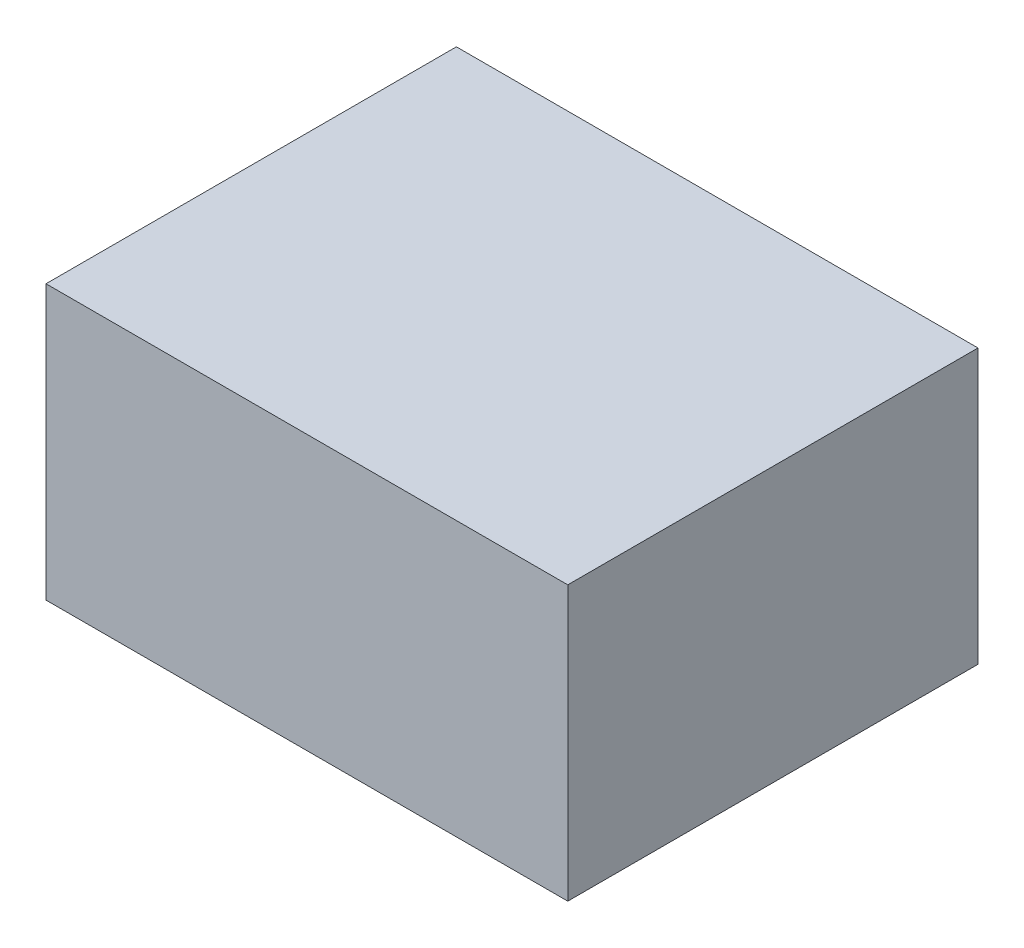
ISO-10303-21;
HEADER;
FILE_DESCRIPTION(('STEP AP214'),'2;1');
FILE_NAME('part.step','',(''),(''),'','','');
FILE_SCHEMA(('AUTOMOTIVE_DESIGN { 1 0 10303 214 1 1 1 1 }'));
ENDSEC;
DATA;
#1=APPLICATION_CONTEXT('core data for automotive mechanical design processes');
#2=APPLICATION_PROTOCOL_DEFINITION('international standard','automotive_design',2000,#1);
#3=PRODUCT_CONTEXT('',#1,'mechanical');
#4=PRODUCT('Part','Part','',(#3));
#5=PRODUCT_RELATED_PRODUCT_CATEGORY('part','',(#4));
#6=PRODUCT_DEFINITION_FORMATION('','',#4);
#7=PRODUCT_DEFINITION_CONTEXT('part definition',#1,'design');
#8=PRODUCT_DEFINITION('design','',#6,#7);
#9=PRODUCT_DEFINITION_SHAPE('','',#8);
#10=(LENGTH_UNIT() NAMED_UNIT(*) SI_UNIT(.MILLI.,.METRE.));
#11=(NAMED_UNIT(*) PLANE_ANGLE_UNIT() SI_UNIT($,.RADIAN.));
#12=(NAMED_UNIT(*) SI_UNIT($,.STERADIAN.) SOLID_ANGLE_UNIT());
#13=UNCERTAINTY_MEASURE_WITH_UNIT(LENGTH_MEASURE(1.E-05),#10,'distance_accuracy_value','');
#14=(GEOMETRIC_REPRESENTATION_CONTEXT(3) GLOBAL_UNCERTAINTY_ASSIGNED_CONTEXT((#13)) GLOBAL_UNIT_ASSIGNED_CONTEXT((#10,
#11,#12)) REPRESENTATION_CONTEXT('',''));
#15=CARTESIAN_POINT('',(0.,0.,0.));
#16=DIRECTION('',(0.,0.,1.));
#17=DIRECTION('',(1.,0.,0.));
#18=AXIS2_PLACEMENT_3D('',#15,#16,#17);
#19=CARTESIAN_POINT('',(31.2004678577881,-5.,-30.5774127582542));
#20=DIRECTION('',(0.000283411690605284,0.,-0.999999959838906));
#21=DIRECTION('',(0.,-1.,0.));
#22=AXIS2_PLACEMENT_3D('',#19,#20,#21);
#23=PLANE('',#22);
#24=CARTESIAN_POINT('',(26.2502339288941,-1.,-30.5788157124773));
#25=DIRECTION('',(-0.000283411690597351,0.,0.999999959838906));
#26=DIRECTION('',(0.999999959838906,0.,0.000283411690597351));
#27=AXIS2_PLACEMENT_3D('',#24,#25,#26);
#28=CIRCLE('',#27,0.3);
#29=CARTESIAN_POINT('',(26.5502339168457,-1.,-30.5787306889701));
#30=VERTEX_POINT('',#29);
#31=EDGE_CURVE('P0_E22',#30,#30,#28,.T.);
#32=ORIENTED_EDGE('',*,*,#31,.F.);
#33=EDGE_LOOP('',(#32));
#34=FACE_BOUND('',#33,.T.);
#35=ADVANCED_FACE('P0_F15',(#34),#23,.T.);
#36=CARTESIAN_POINT('',(26.2485334587504,-1.,-24.5788159534438));
#37=DIRECTION('',(0.000283411690599935,0.,-0.999999959838906));
#38=DIRECTION('',(0.,-1.,0.));
#39=AXIS2_PLACEMENT_3D('',#36,#37,#38);
#40=PLANE('',#39);
#41=CARTESIAN_POINT('',(26.2485334587504,-1.,-24.5788159534438));
#42=DIRECTION('',(-0.000283411690597351,0.,0.999999959838906));
#43=DIRECTION('',(0.999999959838906,0.,0.000283411690597351));
#44=AXIS2_PLACEMENT_3D('',#41,#42,#43);
#45=CIRCLE('',#44,0.3);
#46=CARTESIAN_POINT('',(26.5485334467021,-1.,-24.5787309299366));
#47=VERTEX_POINT('',#46);
#48=EDGE_CURVE('P0_E10',#47,#47,#45,.T.);
#49=ORIENTED_EDGE('',*,*,#48,.T.);
#50=EDGE_LOOP('',(#49));
#51=FACE_BOUND('',#50,.T.);
#52=ADVANCED_FACE('P0_F36',(#51),#40,.F.);
#53=CARTESIAN_POINT('',(26.250474411688,-1.,-31.4273438158233));
#54=DIRECTION('',(-0.000283411690597351,0.,0.999999959838906));
#55=DIRECTION('',(-0.999999959838906,0.,-0.000283411690597351));
#56=AXIS2_PLACEMENT_3D('',#53,#54,#55);
#57=CYLINDRICAL_SURFACE('',#56,0.3);
#58=ORIENTED_EDGE('',*,*,#48,.F.);
#59=EDGE_LOOP('',(#58));
#60=FACE_BOUND('',#59,.T.);
#61=ORIENTED_EDGE('',*,*,#31,.T.);
#62=EDGE_LOOP('',(#61));
#63=FACE_BOUND('',#62,.T.);
#64=ADVANCED_FACE('P0_F34',(#60,#63),#57,.T.);
#65=CLOSED_SHELL('',(#35,#52,#64));
#66=MANIFOLD_SOLID_BREP('P0_B1',#65);
#67=CARTESIAN_POINT('',(31.2004678577881,-5.,-30.5774127582542));
#68=DIRECTION('',(0.000283411690605285,0.,-0.999999959838906));
#69=DIRECTION('',(0.,-1.,0.));
#70=AXIS2_PLACEMENT_3D('',#67,#68,#69);
#71=PLANE('',#70);
#72=CARTESIAN_POINT('',(28.7902338268848,-1.00000000000002,-30.5780958467831));
#73=DIRECTION('',(-0.000283411690597351,0.,0.999999959838906));
#74=DIRECTION('',(0.999999959838906,0.,0.000283411690597351));
#75=AXIS2_PLACEMENT_3D('',#72,#73,#74);
#76=CIRCLE('',#75,0.3);
#77=CARTESIAN_POINT('',(29.0902338148365,-1.00000000000002,-30.5780108232759));
#78=VERTEX_POINT('',#77);
#79=EDGE_CURVE('P1_E22',#78,#78,#76,.T.);
#80=ORIENTED_EDGE('',*,*,#79,.F.);
#81=EDGE_LOOP('',(#80));
#82=FACE_BOUND('',#81,.T.);
#83=ADVANCED_FACE('P1_F15',(#82),#71,.T.);
#84=CARTESIAN_POINT('',(28.7885333567413,-1.,-24.5780960877496));
#85=DIRECTION('',(0.000283411690599935,0.,-0.999999959838906));
#86=DIRECTION('',(0.,-1.,0.));
#87=AXIS2_PLACEMENT_3D('',#84,#85,#86);
#88=PLANE('',#87);
#89=CARTESIAN_POINT('',(28.7885333567413,-1.,-24.5780960877496));
#90=DIRECTION('',(-0.000283411690597351,0.,0.999999959838906));
#91=DIRECTION('',(0.999999959838906,0.,0.000283411690597351));
#92=AXIS2_PLACEMENT_3D('',#89,#90,#91);
#93=CIRCLE('',#92,0.3);
#94=CARTESIAN_POINT('',(29.0885333446929,-1.,-24.5780110642424));
#95=VERTEX_POINT('',#94);
#96=EDGE_CURVE('P1_E10',#95,#95,#93,.T.);
#97=ORIENTED_EDGE('',*,*,#96,.T.);
#98=EDGE_LOOP('',(#97));
#99=FACE_BOUND('',#98,.T.);
#100=ADVANCED_FACE('P1_F36',(#99),#88,.F.);
#101=CARTESIAN_POINT('',(28.7904743096789,-1.00000000000001,-31.4266239501291));
#102=DIRECTION('',(-0.000283411690597351,0.,0.999999959838906));
#103=DIRECTION('',(-0.999999959838906,0.,-0.000283411690597351));
#104=AXIS2_PLACEMENT_3D('',#101,#102,#103);
#105=CYLINDRICAL_SURFACE('',#104,0.3);
#106=ORIENTED_EDGE('',*,*,#96,.F.);
#107=EDGE_LOOP('',(#106));
#108=FACE_BOUND('',#107,.T.);
#109=ORIENTED_EDGE('',*,*,#79,.T.);
#110=EDGE_LOOP('',(#109));
#111=FACE_BOUND('',#110,.T.);
#112=ADVANCED_FACE('P1_F34',(#108,#111),#105,.T.);
#113=CLOSED_SHELL('',(#83,#100,#112));
#114=MANIFOLD_SOLID_BREP('P1_B1',#113);
#115=CARTESIAN_POINT('',(31.2004678577881,-5.,-30.5774127582542));
#116=DIRECTION('',(0.000283411690605285,0.,-0.999999959838906));
#117=DIRECTION('',(0.,-1.,0.));
#118=AXIS2_PLACEMENT_3D('',#115,#116,#117);
#119=PLANE('',#118);
#120=CARTESIAN_POINT('',(23.7102340309032,-1.,-30.5795355781713));
#121=DIRECTION('',(-0.000283411690597351,0.,0.999999959838906));
#122=DIRECTION('',(0.999999959838906,0.,0.000283411690597351));
#123=AXIS2_PLACEMENT_3D('',#120,#121,#122);
#124=CIRCLE('',#123,0.3);
#125=CARTESIAN_POINT('',(24.0102340188549,-1.,-30.5794505546641));
#126=VERTEX_POINT('',#125);
#127=EDGE_CURVE('P2_E22',#126,#126,#124,.T.);
#128=ORIENTED_EDGE('',*,*,#127,.F.);
#129=EDGE_LOOP('',(#128));
#130=FACE_BOUND('',#129,.T.);
#131=ADVANCED_FACE('P2_F15',(#130),#119,.T.);
#132=CARTESIAN_POINT('',(23.7085335607597,-1.,-24.5795358191379));
#133=DIRECTION('',(0.000283411690599935,0.,-0.999999959838906));
#134=DIRECTION('',(0.,-1.,0.));
#135=AXIS2_PLACEMENT_3D('',#132,#133,#134);
#136=PLANE('',#135);
#137=CARTESIAN_POINT('',(23.7085335607597,-1.,-24.5795358191379));
#138=DIRECTION('',(-0.000283411690597351,0.,0.999999959838906));
#139=DIRECTION('',(0.999999959838906,0.,0.000283411690597351));
#140=AXIS2_PLACEMENT_3D('',#137,#138,#139);
#141=CIRCLE('',#140,0.3);
#142=CARTESIAN_POINT('',(24.0085335487113,-1.,-24.5794507956307));
#143=VERTEX_POINT('',#142);
#144=EDGE_CURVE('P2_E10',#143,#143,#141,.T.);
#145=ORIENTED_EDGE('',*,*,#144,.T.);
#146=EDGE_LOOP('',(#145));
#147=FACE_BOUND('',#146,.T.);
#148=ADVANCED_FACE('P2_F36',(#147),#136,.F.);
#149=CARTESIAN_POINT('',(23.7104745136972,-1.,-31.4280636815173));
#150=DIRECTION('',(-0.000283411690597351,0.,0.999999959838906));
#151=DIRECTION('',(-0.999999959838906,0.,-0.000283411690597351));
#152=AXIS2_PLACEMENT_3D('',#149,#150,#151);
#153=CYLINDRICAL_SURFACE('',#152,0.3);
#154=ORIENTED_EDGE('',*,*,#144,.F.);
#155=EDGE_LOOP('',(#154));
#156=FACE_BOUND('',#155,.T.);
#157=ORIENTED_EDGE('',*,*,#127,.T.);
#158=EDGE_LOOP('',(#157));
#159=FACE_BOUND('',#158,.T.);
#160=ADVANCED_FACE('P2_F34',(#156,#159),#153,.T.);
#161=CLOSED_SHELL('',(#131,#148,#160));
#162=MANIFOLD_SOLID_BREP('P2_B1',#161);
#163=CARTESIAN_POINT('',(27.5073741247072,0.,-22.0351424872939));
#164=DIRECTION('',(1.,0.,0.));
#165=DIRECTION('',(0.,0.,1.));
#166=AXIS2_PLACEMENT_3D('',#163,#164,#165);
#167=PLANE('',#166);
#168=DIRECTION('',(0.,1.,0.));
#169=VECTOR('',#168,1.);
#170=CARTESIAN_POINT('',(27.5073741247072,0.,-24.5578311719774));
#171=LINE('',#170,#169);
#172=CARTESIAN_POINT('',(27.5073741247072,-0.2,-24.5578311719774));
#173=VERTEX_POINT('',#172);
#174=CARTESIAN_POINT('',(27.5073741247072,0.,-24.5578311719774));
#175=VERTEX_POINT('',#174);
#176=EDGE_CURVE('P3_E195',#173,#175,#171,.T.);
#177=ORIENTED_EDGE('',*,*,#176,.T.);
#178=DIRECTION('',(0.,0.,-1.));
#179=VECTOR('',#178,1.);
#180=CARTESIAN_POINT('',(27.5073741247072,0.,-22.0351424872939));
#181=LINE('',#180,#179);
#182=CARTESIAN_POINT('',(27.5073741247072,0.,-30.5578311719774));
#183=VERTEX_POINT('',#182);
#184=EDGE_CURVE('P3_E11',#175,#183,#181,.T.);
#185=ORIENTED_EDGE('',*,*,#184,.T.);
#186=DIRECTION('',(0.,-1.,0.));
#187=VECTOR('',#186,1.);
#188=CARTESIAN_POINT('',(27.5073741247072,0.,-30.5578311719774));
#189=LINE('',#188,#187);
#190=CARTESIAN_POINT('',(27.5073741247072,-0.19999999999999,-30.5578311719774));
#191=VERTEX_POINT('',#190);
#192=EDGE_CURVE('P3_E197',#183,#191,#189,.T.);
#193=ORIENTED_EDGE('',*,*,#192,.T.);
#194=DIRECTION('',(0.,0.,-1.));
#195=VECTOR('',#194,1.);
#196=CARTESIAN_POINT('',(27.5073741247072,-0.2,-22.0351424872939));
#197=LINE('',#196,#195);
#198=EDGE_CURVE('P3_E243',#173,#191,#197,.T.);
#199=ORIENTED_EDGE('',*,*,#198,.F.);
#200=EDGE_LOOP('',(#177,#185,#193,#199));
#201=FACE_BOUND('',#200,.T.);
#202=ADVANCED_FACE('P3_F17',(#201),#167,.F.);
#203=CARTESIAN_POINT('',(24.9926259862587,0.,-22.0351424872939));
#204=DIRECTION('',(1.,0.,0.));
#205=DIRECTION('',(0.,0.,1.));
#206=AXIS2_PLACEMENT_3D('',#203,#204,#205);
#207=PLANE('',#206);
#208=DIRECTION('',(0.,0.,-1.));
#209=VECTOR('',#208,1.);
#210=CARTESIAN_POINT('',(24.9926259862587,-0.19999999999999,-22.0351424872939));
#211=LINE('',#210,#209);
#212=CARTESIAN_POINT('',(24.9926259862587,-0.19999999999999,-24.5578311719774));
#213=VERTEX_POINT('',#212);
#214=CARTESIAN_POINT('',(24.9926259862587,-0.19999999999999,-30.5578311719774));
#215=VERTEX_POINT('',#214);
#216=EDGE_CURVE('P3_E141',#213,#215,#211,.T.);
#217=ORIENTED_EDGE('',*,*,#216,.T.);
#218=DIRECTION('',(0.,-1.,0.));
#219=VECTOR('',#218,1.);
#220=CARTESIAN_POINT('',(24.9926259862587,0.,-30.5578311719774));
#221=LINE('',#220,#219);
#222=CARTESIAN_POINT('',(24.9926259862587,0.,-30.5578311719774));
#223=VERTEX_POINT('',#222);
#224=EDGE_CURVE('P3_E179',#223,#215,#221,.T.);
#225=ORIENTED_EDGE('',*,*,#224,.F.);
#226=DIRECTION('',(0.,0.,-1.));
#227=VECTOR('',#226,1.);
#228=CARTESIAN_POINT('',(24.9926259862587,0.,-22.0351424872939));
#229=LINE('',#228,#227);
#230=CARTESIAN_POINT('',(24.9926259862587,0.,-24.5578311719774));
#231=VERTEX_POINT('',#230);
#232=EDGE_CURVE('P3_E25',#231,#223,#229,.T.);
#233=ORIENTED_EDGE('',*,*,#232,.F.);
#234=DIRECTION('',(0.,1.,0.));
#235=VECTOR('',#234,1.);
#236=CARTESIAN_POINT('',(24.9926259862587,0.,-24.5578311719774));
#237=LINE('',#236,#235);
#238=EDGE_CURVE('P3_E138',#213,#231,#237,.T.);
#239=ORIENTED_EDGE('',*,*,#238,.F.);
#240=EDGE_LOOP('',(#217,#225,#233,#239));
#241=FACE_BOUND('',#240,.T.);
#242=ADVANCED_FACE('P3_F139',(#241),#207,.T.);
#243=CARTESIAN_POINT('',(0.,0.,-22.0351424872938));
#244=DIRECTION('',(0.,-1.,0.));
#245=DIRECTION('',(0.,0.,-1.));
#246=AXIS2_PLACEMENT_3D('',#243,#244,#245);
#247=PLANE('',#246);
#248=ORIENTED_EDGE('',*,*,#232,.T.);
#249=DIRECTION('',(-1.,0.,0.));
#250=VECTOR('',#249,1.);
#251=CARTESIAN_POINT('',(0.,0.,-30.5578311719773));
#252=LINE('',#251,#250);
#253=EDGE_CURVE('P3_E183',#183,#223,#252,.T.);
#254=ORIENTED_EDGE('',*,*,#253,.F.);
#255=ORIENTED_EDGE('',*,*,#184,.F.);
#256=DIRECTION('',(1.,0.,0.));
#257=VECTOR('',#256,1.);
#258=CARTESIAN_POINT('',(0.,0.,-24.5578311719773));
#259=LINE('',#258,#257);
#260=EDGE_CURVE('P3_E146',#231,#175,#259,.T.);
#261=ORIENTED_EDGE('',*,*,#260,.F.);
#262=EDGE_LOOP('',(#248,#254,#255,#261));
#263=FACE_BOUND('',#262,.T.);
#264=ADVANCED_FACE('P3_F277',(#263),#247,.T.);
#265=CARTESIAN_POINT('',(0.,0.2,0.));
#266=DIRECTION('',(0.,1.,0.));
#267=DIRECTION('',(0.,0.,-1.));
#268=AXIS2_PLACEMENT_3D('',#265,#266,#267);
#269=PLANE('',#268);
#270=DIRECTION('',(-1.,0.,0.));
#271=VECTOR('',#270,1.);
#272=CARTESIAN_POINT('',(31.2000000554829,0.2,-30.5578311719774));
#273=LINE('',#272,#271);
#274=CARTESIAN_POINT('',(31.2000000554829,0.2,-30.5578311719774));
#275=VERTEX_POINT('',#274);
#276=CARTESIAN_POINT('',(21.300000055483,0.2,-30.5578311719774));
#277=VERTEX_POINT('',#276);
#278=EDGE_CURVE('P3_E173',#275,#277,#273,.T.);
#279=ORIENTED_EDGE('',*,*,#278,.T.);
#280=DIRECTION('',(0.,0.,1.));
#281=VECTOR('',#280,1.);
#282=CARTESIAN_POINT('',(21.300000055483,0.2,-30.5578311719774));
#283=LINE('',#282,#281);
#284=CARTESIAN_POINT('',(21.300000055483,0.199999999999979,-22.7685030205349));
#285=VERTEX_POINT('',#284);
#286=EDGE_CURVE('P3_E188',#277,#285,#283,.T.);
#287=ORIENTED_EDGE('',*,*,#286,.T.);
#288=DIRECTION('',(0.999999959838906,0.,-0.00028341169060322));
#289=VECTOR('',#288,1.);
#290=CARTESIAN_POINT('',(21.300000055483,0.199999999999979,-22.7685030205349));
#291=LINE('',#290,#289);
#292=CARTESIAN_POINT('',(31.2004679132711,0.19999999999999,-22.7713089289809));
#293=VERTEX_POINT('',#292);
#294=EDGE_CURVE('P3_E48',#285,#293,#291,.T.);
#295=ORIENTED_EDGE('',*,*,#294,.T.);
#296=DIRECTION('',(-6.00855905483231E-05,0.,-0.999999998194861));
#297=VECTOR('',#296,1.);
#298=CARTESIAN_POINT('',(31.2004679132711,0.19999999999999,-22.7713089289809));
#299=LINE('',#298,#297);
#300=EDGE_CURVE('P3_E36',#293,#275,#299,.T.);
#301=ORIENTED_EDGE('',*,*,#300,.T.);
#302=EDGE_LOOP('',(#279,#287,#295,#301));
#303=FACE_BOUND('',#302,.T.);
#304=ADVANCED_FACE('P3_F317',(#303),#269,.T.);
#305=CARTESIAN_POINT('',(31.2004679132711,-5.,-22.7713089289809));
#306=DIRECTION('',(0.999999998194861,0.,-6.00855905536769E-05));
#307=DIRECTION('',(0.,-1.,0.));
#308=AXIS2_PLACEMENT_3D('',#305,#306,#307);
#309=PLANE('',#308);
#310=DIRECTION('',(0.,1.,0.));
#311=VECTOR('',#310,1.);
#312=CARTESIAN_POINT('',(31.2000000554829,-5.,-30.5578311719774));
#313=LINE('',#312,#311);
#314=CARTESIAN_POINT('',(31.2000000554829,-5.,-30.5578311719774));
#315=VERTEX_POINT('',#314);
#316=EDGE_CURVE('P3_E196',#315,#275,#313,.T.);
#317=ORIENTED_EDGE('',*,*,#316,.T.);
#318=ORIENTED_EDGE('',*,*,#300,.F.);
#319=DIRECTION('',(0.,1.,0.));
#320=VECTOR('',#319,1.);
#321=CARTESIAN_POINT('',(31.2004679132711,-5.,-22.7713089289809));
#322=LINE('',#321,#320);
#323=CARTESIAN_POINT('',(31.2004679132711,-5.,-22.7713089289809));
#324=VERTEX_POINT('',#323);
#325=EDGE_CURVE('P3_E186',#324,#293,#322,.T.);
#326=ORIENTED_EDGE('',*,*,#325,.F.);
#327=DIRECTION('',(-6.00855905483249E-05,0.,-0.999999998194861));
#328=VECTOR('',#327,1.);
#329=CARTESIAN_POINT('',(31.2004679132711,-5.,-22.7713089289809));
#330=LINE('',#329,#328);
#331=EDGE_CURVE('P3_E202',#324,#315,#330,.T.);
#332=ORIENTED_EDGE('',*,*,#331,.T.);
#333=EDGE_LOOP('',(#317,#318,#326,#332));
#334=FACE_BOUND('',#333,.T.);
#335=ADVANCED_FACE('P3_F324',(#334),#309,.T.);
#336=CARTESIAN_POINT('',(21.300000055483,-5.,-22.7685030205349));
#337=DIRECTION('',(0.000283411690599961,0.,0.999999959838906));
#338=DIRECTION('',(8.51352300530525E-13,-1.,0.));
#339=AXIS2_PLACEMENT_3D('',#336,#337,#338);
#340=PLANE('',#339);
#341=ORIENTED_EDGE('',*,*,#325,.T.);
#342=ORIENTED_EDGE('',*,*,#294,.F.);
#343=DIRECTION('',(0.,1.,0.));
#344=VECTOR('',#343,1.);
#345=CARTESIAN_POINT('',(21.300000055483,-5.,-22.7685030205349));
#346=LINE('',#345,#344);
#347=CARTESIAN_POINT('',(21.300000055483,-5.,-22.7685030205349));
#348=VERTEX_POINT('',#347);
#349=EDGE_CURVE('P3_E265',#348,#285,#346,.T.);
#350=ORIENTED_EDGE('',*,*,#349,.F.);
#351=DIRECTION('',(0.999999959838906,0.,-0.00028341169060533));
#352=VECTOR('',#351,1.);
#353=CARTESIAN_POINT('',(21.300000055483,-5.,-22.7685030205349));
#354=LINE('',#353,#352);
#355=EDGE_CURVE('P3_E208',#348,#324,#354,.T.);
#356=ORIENTED_EDGE('',*,*,#355,.T.);
#357=EDGE_LOOP('',(#341,#342,#350,#356));
#358=FACE_BOUND('',#357,.T.);
#359=ADVANCED_FACE('P3_F325',(#358),#340,.T.);
#360=CARTESIAN_POINT('',(21.300000055483,-5.,-30.5578311719774));
#361=DIRECTION('',(-1.,0.,0.));
#362=DIRECTION('',(0.,0.,1.));
#363=AXIS2_PLACEMENT_3D('',#360,#361,#362);
#364=PLANE('',#363);
#365=ORIENTED_EDGE('',*,*,#349,.T.);
#366=ORIENTED_EDGE('',*,*,#286,.F.);
#367=DIRECTION('',(0.,1.,0.));
#368=VECTOR('',#367,1.);
#369=CARTESIAN_POINT('',(21.300000055483,-5.,-30.5578311719774));
#370=LINE('',#369,#368);
#371=CARTESIAN_POINT('',(21.300000055483,-5.,-30.5578311719774));
#372=VERTEX_POINT('',#371);
#373=EDGE_CURVE('P3_E172',#372,#277,#370,.T.);
#374=ORIENTED_EDGE('',*,*,#373,.F.);
#375=DIRECTION('',(0.,0.,1.));
#376=VECTOR('',#375,1.);
#377=CARTESIAN_POINT('',(21.300000055483,-5.,-30.5578311719774));
#378=LINE('',#377,#376);
#379=EDGE_CURVE('P3_E256',#372,#348,#378,.T.);
#380=ORIENTED_EDGE('',*,*,#379,.T.);
#381=EDGE_LOOP('',(#365,#366,#374,#380));
#382=FACE_BOUND('',#381,.T.);
#383=ADVANCED_FACE('P3_F307',(#382),#364,.T.);
#384=CARTESIAN_POINT('',(0.,-5.,0.));
#385=DIRECTION('',(0.,1.,0.));
#386=DIRECTION('',(0.,0.,-1.));
#387=AXIS2_PLACEMENT_3D('',#384,#385,#386);
#388=PLANE('',#387);
#389=DIRECTION('',(-1.,0.,0.));
#390=VECTOR('',#389,1.);
#391=CARTESIAN_POINT('',(31.2000000554829,-5.,-30.5578311719774));
#392=LINE('',#391,#390);
#393=EDGE_CURVE('P3_E203',#315,#372,#392,.T.);
#394=ORIENTED_EDGE('',*,*,#393,.F.);
#395=ORIENTED_EDGE('',*,*,#331,.F.);
#396=ORIENTED_EDGE('',*,*,#355,.F.);
#397=ORIENTED_EDGE('',*,*,#379,.F.);
#398=EDGE_LOOP('',(#394,#395,#396,#397));
#399=FACE_BOUND('',#398,.T.);
#400=ADVANCED_FACE('P3_F298',(#399),#388,.F.);
#401=CARTESIAN_POINT('',(21.5000000554829,-4.8,-24.5578311719774));
#402=DIRECTION('',(-1.,0.,0.));
#403=DIRECTION('',(0.,0.,1.));
#404=AXIS2_PLACEMENT_3D('',#401,#402,#403);
#405=PLANE('',#404);
#406=DIRECTION('',(0.,1.,0.));
#407=VECTOR('',#406,1.);
#408=CARTESIAN_POINT('',(21.5000000554829,-4.8,-30.5578311719774));
#409=LINE('',#408,#407);
#410=CARTESIAN_POINT('',(21.5000000554829,-4.8,-30.5578311719774));
#411=VERTEX_POINT('',#410);
#412=CARTESIAN_POINT('',(21.500000055483,-0.19999999999999,-30.5578311719774));
#413=VERTEX_POINT('',#412);
#414=EDGE_CURVE('P3_E176',#411,#413,#409,.T.);
#415=ORIENTED_EDGE('',*,*,#414,.T.);
#416=DIRECTION('',(0.,0.,-1.));
#417=VECTOR('',#416,1.);
#418=CARTESIAN_POINT('',(21.5000000554829,-0.19999999999999,-24.5578311719774));
#419=LINE('',#418,#417);
#420=CARTESIAN_POINT('',(21.5000000554829,-0.19999999999999,-24.5578311719774));
#421=VERTEX_POINT('',#420);
#422=EDGE_CURVE('P3_E159',#421,#413,#419,.T.);
#423=ORIENTED_EDGE('',*,*,#422,.F.);
#424=DIRECTION('',(0.,1.,0.));
#425=VECTOR('',#424,1.);
#426=CARTESIAN_POINT('',(21.5000000554829,-4.8,-24.5578311719774));
#427=LINE('',#426,#425);
#428=CARTESIAN_POINT('',(21.5000000554829,-4.8,-24.5578311719774));
#429=VERTEX_POINT('',#428);
#430=EDGE_CURVE('P3_E149',#429,#421,#427,.T.);
#431=ORIENTED_EDGE('',*,*,#430,.F.);
#432=DIRECTION('',(0.,0.,-1.));
#433=VECTOR('',#432,1.);
#434=CARTESIAN_POINT('',(21.5000000554829,-4.8,-24.5578311719774));
#435=LINE('',#434,#433);
#436=EDGE_CURVE('P3_E207',#429,#411,#435,.T.);
#437=ORIENTED_EDGE('',*,*,#436,.T.);
#438=EDGE_LOOP('',(#415,#423,#431,#437));
#439=FACE_BOUND('',#438,.T.);
#440=ADVANCED_FACE('P3_F296',(#439),#405,.F.);
#441=CARTESIAN_POINT('',(31.0000000554829,-4.8,-24.5578311719774));
#442=DIRECTION('',(0.,-1.,0.));
#443=DIRECTION('',(0.,0.,-1.));
#444=AXIS2_PLACEMENT_3D('',#441,#442,#443);
#445=PLANE('',#444);
#446=DIRECTION('',(-1.,0.,0.));
#447=VECTOR('',#446,1.);
#448=CARTESIAN_POINT('',(31.0000000554829,-4.8,-30.5578311719775));
#449=LINE('',#448,#447);
#450=CARTESIAN_POINT('',(31.0000000554829,-4.8,-30.5578311719775));
#451=VERTEX_POINT('',#450);
#452=EDGE_CURVE('P3_E177',#451,#411,#449,.T.);
#453=ORIENTED_EDGE('',*,*,#452,.T.);
#454=ORIENTED_EDGE('',*,*,#436,.F.);
#455=DIRECTION('',(-1.,0.,0.));
#456=VECTOR('',#455,1.);
#457=CARTESIAN_POINT('',(31.0000000554829,-4.8,-24.5578311719774));
#458=LINE('',#457,#456);
#459=CARTESIAN_POINT('',(31.0000000554829,-4.8,-24.5578311719774));
#460=VERTEX_POINT('',#459);
#461=EDGE_CURVE('P3_E241',#460,#429,#458,.T.);
#462=ORIENTED_EDGE('',*,*,#461,.F.);
#463=DIRECTION('',(0.,0.,-1.));
#464=VECTOR('',#463,1.);
#465=CARTESIAN_POINT('',(31.0000000554829,-4.8,-24.5578311719774));
#466=LINE('',#465,#464);
#467=EDGE_CURVE('P3_E249',#460,#451,#466,.T.);
#468=ORIENTED_EDGE('',*,*,#467,.T.);
#469=EDGE_LOOP('',(#453,#454,#462,#468));
#470=FACE_BOUND('',#469,.T.);
#471=ADVANCED_FACE('P3_F292',(#470),#445,.F.);
#472=CARTESIAN_POINT('',(31.0000000554829,-0.2,-24.5578311719774));
#473=DIRECTION('',(1.,0.,0.));
#474=DIRECTION('',(0.,0.,-1.));
#475=AXIS2_PLACEMENT_3D('',#472,#473,#474);
#476=PLANE('',#475);
#477=DIRECTION('',(0.,-1.,0.));
#478=VECTOR('',#477,1.);
#479=CARTESIAN_POINT('',(31.0000000554829,-0.19999999999999,-30.5578311719774));
#480=LINE('',#479,#478);
#481=CARTESIAN_POINT('',(31.0000000554829,-0.19999999999999,-30.5578311719774));
#482=VERTEX_POINT('',#481);
#483=EDGE_CURVE('P3_E218',#482,#451,#480,.T.);
#484=ORIENTED_EDGE('',*,*,#483,.T.);
#485=ORIENTED_EDGE('',*,*,#467,.F.);
#486=DIRECTION('',(0.,-1.,0.));
#487=VECTOR('',#486,1.);
#488=CARTESIAN_POINT('',(31.0000000554829,-0.2,-24.5578311719774));
#489=LINE('',#488,#487);
#490=CARTESIAN_POINT('',(31.0000000554829,-0.2,-24.5578311719774));
#491=VERTEX_POINT('',#490);
#492=EDGE_CURVE('P3_E236',#491,#460,#489,.T.);
#493=ORIENTED_EDGE('',*,*,#492,.F.);
#494=DIRECTION('',(0.,0.,-1.));
#495=VECTOR('',#494,1.);
#496=CARTESIAN_POINT('',(31.0000000554829,-0.2,-24.5578311719774));
#497=LINE('',#496,#495);
#498=EDGE_CURVE('P3_E250',#491,#482,#497,.T.);
#499=ORIENTED_EDGE('',*,*,#498,.T.);
#500=EDGE_LOOP('',(#484,#485,#493,#499));
#501=FACE_BOUND('',#500,.T.);
#502=ADVANCED_FACE('P3_F289',(#501),#476,.F.);
#503=CARTESIAN_POINT('',(21.5000000554829,-0.19999999999999,-24.5578311719774));
#504=DIRECTION('',(0.,1.,0.));
#505=DIRECTION('',(0.,0.,-1.));
#506=AXIS2_PLACEMENT_3D('',#503,#504,#505);
#507=PLANE('',#506);
#508=DIRECTION('',(1.,0.,0.));
#509=VECTOR('',#508,1.);
#510=CARTESIAN_POINT('',(21.5000000554829,-0.19999999999999,-24.5578311719774));
#511=LINE('',#510,#509);
#512=EDGE_CURVE('P3_E233',#173,#491,#511,.T.);
#513=ORIENTED_EDGE('',*,*,#512,.F.);
#514=ORIENTED_EDGE('',*,*,#198,.T.);
#515=DIRECTION('',(1.,0.,0.));
#516=VECTOR('',#515,1.);
#517=CARTESIAN_POINT('',(21.500000055483,-0.19999999999999,-30.5578311719774));
#518=LINE('',#517,#516);
#519=EDGE_CURVE('P3_E224',#191,#482,#518,.T.);
#520=ORIENTED_EDGE('',*,*,#519,.T.);
#521=ORIENTED_EDGE('',*,*,#498,.F.);
#522=EDGE_LOOP('',(#513,#514,#520,#521));
#523=FACE_BOUND('',#522,.T.);
#524=ADVANCED_FACE('P3_F288',(#523),#507,.F.);
#525=CARTESIAN_POINT('',(0.,0.,-24.5578311719773));
#526=DIRECTION('',(0.,0.,-1.));
#527=DIRECTION('',(0.,-1.,0.));
#528=AXIS2_PLACEMENT_3D('',#525,#526,#527);
#529=PLANE('',#528);
#530=ORIENTED_EDGE('',*,*,#430,.T.);
#531=DIRECTION('',(1.,0.,0.));
#532=VECTOR('',#531,1.);
#533=CARTESIAN_POINT('',(21.5000000554829,-0.19999999999999,-24.5578311719774));
#534=LINE('',#533,#532);
#535=EDGE_CURVE('P3_E155',#421,#213,#534,.T.);
#536=ORIENTED_EDGE('',*,*,#535,.T.);
#537=ORIENTED_EDGE('',*,*,#238,.T.);
#538=ORIENTED_EDGE('',*,*,#260,.T.);
#539=ORIENTED_EDGE('',*,*,#176,.F.);
#540=ORIENTED_EDGE('',*,*,#512,.T.);
#541=ORIENTED_EDGE('',*,*,#492,.T.);
#542=ORIENTED_EDGE('',*,*,#461,.T.);
#543=EDGE_LOOP('',(#530,#536,#537,#538,#539,#540,#541,#542));
#544=FACE_BOUND('',#543,.T.);
#545=ADVANCED_FACE('P3_F153',(#544),#529,.T.);
#546=CARTESIAN_POINT('',(31.2000000554829,-5.,-30.5578311719774));
#547=DIRECTION('',(0.,0.,-1.));
#548=DIRECTION('',(0.,-1.,0.));
#549=AXIS2_PLACEMENT_3D('',#546,#547,#548);
#550=PLANE('',#549);
#551=ORIENTED_EDGE('',*,*,#253,.T.);
#552=ORIENTED_EDGE('',*,*,#224,.T.);
#553=DIRECTION('',(1.,0.,0.));
#554=VECTOR('',#553,1.);
#555=CARTESIAN_POINT('',(21.500000055483,-0.19999999999999,-30.5578311719774));
#556=LINE('',#555,#554);
#557=EDGE_CURVE('P3_E164',#413,#215,#556,.T.);
#558=ORIENTED_EDGE('',*,*,#557,.F.);
#559=ORIENTED_EDGE('',*,*,#414,.F.);
#560=ORIENTED_EDGE('',*,*,#452,.F.);
#561=ORIENTED_EDGE('',*,*,#483,.F.);
#562=ORIENTED_EDGE('',*,*,#519,.F.);
#563=ORIENTED_EDGE('',*,*,#192,.F.);
#564=EDGE_LOOP('',(#551,#552,#558,#559,#560,#561,#562,#563));
#565=FACE_BOUND('',#564,.T.);
#566=ORIENTED_EDGE('',*,*,#373,.T.);
#567=ORIENTED_EDGE('',*,*,#278,.F.);
#568=ORIENTED_EDGE('',*,*,#316,.F.);
#569=ORIENTED_EDGE('',*,*,#393,.T.);
#570=EDGE_LOOP('',(#566,#567,#568,#569));
#571=FACE_BOUND('',#570,.T.);
#572=ADVANCED_FACE('P3_F276',(#565,#571),#550,.T.);
#573=CARTESIAN_POINT('',(21.5000000554829,-0.19999999999999,-24.5578311719774));
#574=DIRECTION('',(0.,1.,0.));
#575=DIRECTION('',(0.,0.,-1.));
#576=AXIS2_PLACEMENT_3D('',#573,#574,#575);
#577=PLANE('',#576);
#578=ORIENTED_EDGE('',*,*,#216,.F.);
#579=ORIENTED_EDGE('',*,*,#535,.F.);
#580=ORIENTED_EDGE('',*,*,#422,.T.);
#581=ORIENTED_EDGE('',*,*,#557,.T.);
#582=EDGE_LOOP('',(#578,#579,#580,#581));
#583=FACE_BOUND('',#582,.T.);
#584=ADVANCED_FACE('P3_F162',(#583),#577,.F.);
#585=CLOSED_SHELL('',(#202,#242,#264,#304,#335,#359,#383,#400,#440,#471,#502,#524,#545,#572,#584));
#586=MANIFOLD_SOLID_BREP('P3_B1',#585);
#587=ADVANCED_BREP_SHAPE_REPRESENTATION('',(#18,#66,#114,#162,#586),#14);
#588=SHAPE_DEFINITION_REPRESENTATION(#9,#587);
ENDSEC;
END-ISO-10303-21;
